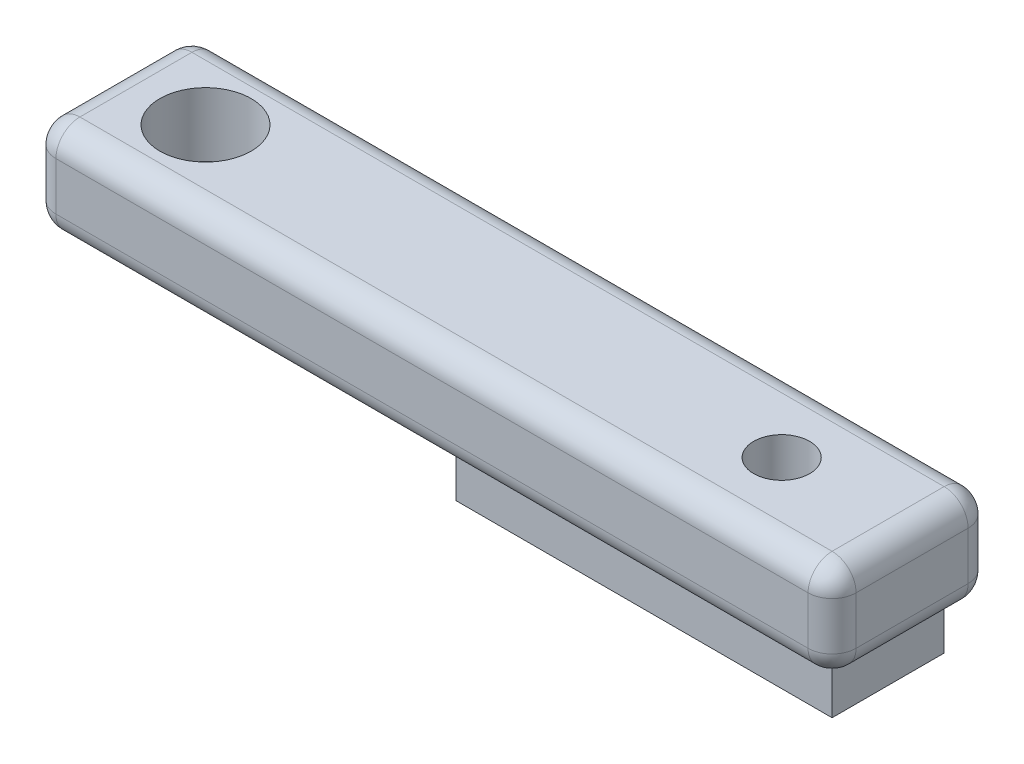
ISO-10303-21;
HEADER;
FILE_DESCRIPTION(('STEP AP214'),'2;1');
FILE_NAME('part.step','',(''),(''),'','','');
FILE_SCHEMA(('AUTOMOTIVE_DESIGN { 1 0 10303 214 1 1 1 1 }'));
ENDSEC;
DATA;
#1=APPLICATION_CONTEXT('core data for automotive mechanical design processes');
#2=APPLICATION_PROTOCOL_DEFINITION('international standard','automotive_design',2000,#1);
#3=PRODUCT_CONTEXT('',#1,'mechanical');
#4=PRODUCT('Part','Part','',(#3));
#5=PRODUCT_RELATED_PRODUCT_CATEGORY('part','',(#4));
#6=PRODUCT_DEFINITION_FORMATION('','',#4);
#7=PRODUCT_DEFINITION_CONTEXT('part definition',#1,'design');
#8=PRODUCT_DEFINITION('design','',#6,#7);
#9=PRODUCT_DEFINITION_SHAPE('','',#8);
#10=(LENGTH_UNIT() NAMED_UNIT(*) SI_UNIT(.MILLI.,.METRE.));
#11=(NAMED_UNIT(*) PLANE_ANGLE_UNIT() SI_UNIT($,.RADIAN.));
#12=(NAMED_UNIT(*) SI_UNIT($,.STERADIAN.) SOLID_ANGLE_UNIT());
#13=UNCERTAINTY_MEASURE_WITH_UNIT(LENGTH_MEASURE(1.E-05),#10,'distance_accuracy_value','');
#14=(GEOMETRIC_REPRESENTATION_CONTEXT(3) GLOBAL_UNCERTAINTY_ASSIGNED_CONTEXT((#13)) GLOBAL_UNIT_ASSIGNED_CONTEXT((#10,
#11,#12)) REPRESENTATION_CONTEXT('',''));
#15=CARTESIAN_POINT('',(0.,0.,0.));
#16=DIRECTION('',(0.,0.,1.));
#17=DIRECTION('',(1.,0.,0.));
#18=AXIS2_PLACEMENT_3D('',#15,#16,#17);
#19=CARTESIAN_POINT('',(0.,0.,0.));
#20=DIRECTION('',(0.,1.,0.));
#21=DIRECTION('',(0.,0.,1.));
#22=AXIS2_PLACEMENT_3D('',#19,#20,#21);
#23=PLANE('',#22);
#24=CARTESIAN_POINT('',(-19.15,0.,0.));
#25=DIRECTION('',(0.,1.,0.));
#26=DIRECTION('',(0.,0.,1.));
#27=AXIS2_PLACEMENT_3D('',#24,#25,#26);
#28=CIRCLE('',#27,1.5);
#29=CARTESIAN_POINT('',(-19.15,0.,1.5));
#30=VERTEX_POINT('',#29);
#31=EDGE_CURVE('E43',#30,#30,#28,.T.);
#32=ORIENTED_EDGE('',*,*,#31,.T.);
#33=EDGE_LOOP('',(#32));
#34=FACE_BOUND('',#33,.T.);
#35=DIRECTION('',(0.,0.,-1.));
#36=VECTOR('',#35,1.);
#37=CARTESIAN_POINT('',(0.,0.,3.5));
#38=LINE('',#37,#36);
#39=CARTESIAN_POINT('',(0.,0.,3.5));
#40=VERTEX_POINT('',#39);
#41=CARTESIAN_POINT('',(0.,0.,-3.5));
#42=VERTEX_POINT('',#41);
#43=EDGE_CURVE('E56',#40,#42,#38,.T.);
#44=ORIENTED_EDGE('',*,*,#43,.F.);
#45=DIRECTION('',(1.,0.,0.));
#46=VECTOR('',#45,1.);
#47=CARTESIAN_POINT('',(0.,0.,3.5));
#48=LINE('',#47,#46);
#49=CARTESIAN_POINT('',(-23.5,0.,3.5));
#50=VERTEX_POINT('',#49);
#51=EDGE_CURVE('E211',#40,#50,#48,.F.);
#52=ORIENTED_EDGE('',*,*,#51,.T.);
#53=DIRECTION('',(0.,0.,1.));
#54=VECTOR('',#53,1.);
#55=CARTESIAN_POINT('',(-23.5,0.,0.));
#56=LINE('',#55,#54);
#57=CARTESIAN_POINT('',(-23.5,0.,-3.5));
#58=VERTEX_POINT('',#57);
#59=EDGE_CURVE('E209',#50,#58,#56,.F.);
#60=ORIENTED_EDGE('',*,*,#59,.T.);
#61=DIRECTION('',(-1.,0.,0.));
#62=VECTOR('',#61,1.);
#63=CARTESIAN_POINT('',(0.,0.,-3.5));
#64=LINE('',#63,#62);
#65=EDGE_CURVE('E207',#58,#42,#64,.F.);
#66=ORIENTED_EDGE('',*,*,#65,.T.);
#67=EDGE_LOOP('',(#44,#52,#60,#66));
#68=FACE_BOUND('',#67,.T.);
#69=ADVANCED_FACE('F39',(#34,#68),#23,.F.);
#70=CARTESIAN_POINT('',(25.,6.,-5.));
#71=DIRECTION('',(-1.,0.,0.));
#72=DIRECTION('',(0.,0.,1.));
#73=AXIS2_PLACEMENT_3D('',#70,#71,#72);
#74=PLANE('',#73);
#75=DIRECTION('',(0.,0.,-1.));
#76=VECTOR('',#75,1.);
#77=CARTESIAN_POINT('',(25.,4.5,5.));
#78=LINE('',#77,#76);
#79=CARTESIAN_POINT('',(25.,4.5,-3.5));
#80=VERTEX_POINT('',#79);
#81=CARTESIAN_POINT('',(25.,4.5,3.5));
#82=VERTEX_POINT('',#81);
#83=EDGE_CURVE('E202',#80,#82,#78,.F.);
#84=ORIENTED_EDGE('',*,*,#83,.T.);
#85=DIRECTION('',(0.,-1.,0.));
#86=VECTOR('',#85,1.);
#87=CARTESIAN_POINT('',(25.,6.,3.5));
#88=LINE('',#87,#86);
#89=CARTESIAN_POINT('',(25.,1.5,3.5));
#90=VERTEX_POINT('',#89);
#91=EDGE_CURVE('E205',#82,#90,#88,.T.);
#92=ORIENTED_EDGE('',*,*,#91,.T.);
#93=DIRECTION('',(0.,0.,-1.));
#94=VECTOR('',#93,1.);
#95=CARTESIAN_POINT('',(25.,1.5,-5.));
#96=LINE('',#95,#94);
#97=CARTESIAN_POINT('',(25.,1.5,-3.5));
#98=VERTEX_POINT('',#97);
#99=EDGE_CURVE('E200',#90,#98,#96,.T.);
#100=ORIENTED_EDGE('',*,*,#99,.T.);
#101=DIRECTION('',(0.,-1.,0.));
#102=VECTOR('',#101,1.);
#103=CARTESIAN_POINT('',(25.,6.,-3.5));
#104=LINE('',#103,#102);
#105=EDGE_CURVE('E198',#98,#80,#104,.F.);
#106=ORIENTED_EDGE('',*,*,#105,.T.);
#107=EDGE_LOOP('',(#84,#92,#100,#106));
#108=FACE_BOUND('',#107,.T.);
#109=ADVANCED_FACE('F382',(#108),#74,.F.);
#110=CARTESIAN_POINT('',(-25.,6.,-5.));
#111=DIRECTION('',(0.,0.,1.));
#112=DIRECTION('',(1.,0.,0.));
#113=AXIS2_PLACEMENT_3D('',#110,#111,#112);
#114=PLANE('',#113);
#115=DIRECTION('',(-1.,0.,0.));
#116=VECTOR('',#115,1.);
#117=CARTESIAN_POINT('',(25.,4.5,-5.));
#118=LINE('',#117,#116);
#119=CARTESIAN_POINT('',(-23.5,4.5,-5.));
#120=VERTEX_POINT('',#119);
#121=CARTESIAN_POINT('',(23.5,4.5,-5.));
#122=VERTEX_POINT('',#121);
#123=EDGE_CURVE('E48',#120,#122,#118,.F.);
#124=ORIENTED_EDGE('',*,*,#123,.T.);
#125=DIRECTION('',(0.,-1.,0.));
#126=VECTOR('',#125,1.);
#127=CARTESIAN_POINT('',(23.5,6.,-5.));
#128=LINE('',#127,#126);
#129=CARTESIAN_POINT('',(23.5,1.5,-5.));
#130=VERTEX_POINT('',#129);
#131=EDGE_CURVE('E11',#122,#130,#128,.T.);
#132=ORIENTED_EDGE('',*,*,#131,.T.);
#133=DIRECTION('',(-1.,0.,0.));
#134=VECTOR('',#133,1.);
#135=CARTESIAN_POINT('',(-25.,1.5,-5.));
#136=LINE('',#135,#134);
#137=CARTESIAN_POINT('',(-23.5,1.5,-5.));
#138=VERTEX_POINT('',#137);
#139=EDGE_CURVE('E233',#130,#138,#136,.T.);
#140=ORIENTED_EDGE('',*,*,#139,.T.);
#141=DIRECTION('',(0.,-1.,0.));
#142=VECTOR('',#141,1.);
#143=CARTESIAN_POINT('',(-23.5,6.,-5.));
#144=LINE('',#143,#142);
#145=EDGE_CURVE('E235',#138,#120,#144,.F.);
#146=ORIENTED_EDGE('',*,*,#145,.T.);
#147=EDGE_LOOP('',(#124,#132,#140,#146));
#148=FACE_BOUND('',#147,.T.);
#149=ADVANCED_FACE('F387',(#148),#114,.F.);
#150=CARTESIAN_POINT('',(-25.,6.,-5.));
#151=DIRECTION('',(1.,0.,0.));
#152=DIRECTION('',(0.,0.,-1.));
#153=AXIS2_PLACEMENT_3D('',#150,#151,#152);
#154=PLANE('',#153);
#155=DIRECTION('',(0.,-1.,0.));
#156=VECTOR('',#155,1.);
#157=CARTESIAN_POINT('',(-25.,6.,3.5));
#158=LINE('',#157,#156);
#159=CARTESIAN_POINT('',(-25.,1.5,3.5));
#160=VERTEX_POINT('',#159);
#161=CARTESIAN_POINT('',(-25.,4.5,3.5));
#162=VERTEX_POINT('',#161);
#163=EDGE_CURVE('E228',#160,#162,#158,.F.);
#164=ORIENTED_EDGE('',*,*,#163,.T.);
#165=DIRECTION('',(0.,0.,1.));
#166=VECTOR('',#165,1.);
#167=CARTESIAN_POINT('',(-25.,4.5,-5.));
#168=LINE('',#167,#166);
#169=CARTESIAN_POINT('',(-25.,4.5,-3.5));
#170=VERTEX_POINT('',#169);
#171=EDGE_CURVE('E230',#162,#170,#168,.F.);
#172=ORIENTED_EDGE('',*,*,#171,.T.);
#173=DIRECTION('',(0.,-1.,0.));
#174=VECTOR('',#173,1.);
#175=CARTESIAN_POINT('',(-25.,6.,-3.5));
#176=LINE('',#175,#174);
#177=CARTESIAN_POINT('',(-25.,1.5,-3.5));
#178=VERTEX_POINT('',#177);
#179=EDGE_CURVE('E224',#170,#178,#176,.T.);
#180=ORIENTED_EDGE('',*,*,#179,.T.);
#181=DIRECTION('',(0.,0.,1.));
#182=VECTOR('',#181,1.);
#183=CARTESIAN_POINT('',(-25.,1.5,-5.));
#184=LINE('',#183,#182);
#185=EDGE_CURVE('E226',#178,#160,#184,.T.);
#186=ORIENTED_EDGE('',*,*,#185,.T.);
#187=EDGE_LOOP('',(#164,#172,#180,#186));
#188=FACE_BOUND('',#187,.T.);
#189=ADVANCED_FACE('F323',(#188),#154,.F.);
#190=CARTESIAN_POINT('',(-25.,6.,5.));
#191=DIRECTION('',(0.,0.,-1.));
#192=DIRECTION('',(-1.,0.,0.));
#193=AXIS2_PLACEMENT_3D('',#190,#191,#192);
#194=PLANE('',#193);
#195=DIRECTION('',(0.,-1.,0.));
#196=VECTOR('',#195,1.);
#197=CARTESIAN_POINT('',(23.5,6.,5.));
#198=LINE('',#197,#196);
#199=CARTESIAN_POINT('',(23.5,1.5,5.));
#200=VERTEX_POINT('',#199);
#201=CARTESIAN_POINT('',(23.5,4.5,5.));
#202=VERTEX_POINT('',#201);
#203=EDGE_CURVE('E219',#200,#202,#198,.F.);
#204=ORIENTED_EDGE('',*,*,#203,.T.);
#205=DIRECTION('',(1.,0.,0.));
#206=VECTOR('',#205,1.);
#207=CARTESIAN_POINT('',(-25.,4.5,5.));
#208=LINE('',#207,#206);
#209=CARTESIAN_POINT('',(-23.5,4.5,5.));
#210=VERTEX_POINT('',#209);
#211=EDGE_CURVE('E221',#202,#210,#208,.F.);
#212=ORIENTED_EDGE('',*,*,#211,.T.);
#213=DIRECTION('',(0.,-1.,0.));
#214=VECTOR('',#213,1.);
#215=CARTESIAN_POINT('',(-23.5,6.,5.));
#216=LINE('',#215,#214);
#217=CARTESIAN_POINT('',(-23.5,1.5,5.));
#218=VERTEX_POINT('',#217);
#219=EDGE_CURVE('E215',#210,#218,#216,.T.);
#220=ORIENTED_EDGE('',*,*,#219,.T.);
#221=DIRECTION('',(1.,0.,0.));
#222=VECTOR('',#221,1.);
#223=CARTESIAN_POINT('',(-25.,1.5,5.));
#224=LINE('',#223,#222);
#225=EDGE_CURVE('E217',#218,#200,#224,.T.);
#226=ORIENTED_EDGE('',*,*,#225,.T.);
#227=EDGE_LOOP('',(#204,#212,#220,#226));
#228=FACE_BOUND('',#227,.T.);
#229=ADVANCED_FACE('F314',(#228),#194,.F.);
#230=CARTESIAN_POINT('',(0.,6.,0.));
#231=DIRECTION('',(0.,1.,0.));
#232=DIRECTION('',(0.,0.,1.));
#233=AXIS2_PLACEMENT_3D('',#230,#231,#232);
#234=PLANE('',#233);
#235=CARTESIAN_POINT('',(16.85,6.,0.));
#236=DIRECTION('',(0.,1.,0.));
#237=DIRECTION('',(0.,0.,1.));
#238=AXIS2_PLACEMENT_3D('',#235,#236,#237);
#239=CIRCLE('',#238,1.75);
#240=CARTESIAN_POINT('',(16.85,6.,1.75));
#241=VERTEX_POINT('',#240);
#242=EDGE_CURVE('E360',#241,#241,#239,.T.);
#243=ORIENTED_EDGE('',*,*,#242,.F.);
#244=EDGE_LOOP('',(#243));
#245=FACE_BOUND('',#244,.T.);
#246=DIRECTION('',(1.,0.,0.));
#247=VECTOR('',#246,1.);
#248=CARTESIAN_POINT('',(25.,6.,3.5));
#249=LINE('',#248,#247);
#250=CARTESIAN_POINT('',(-23.5,6.,3.5));
#251=VERTEX_POINT('',#250);
#252=CARTESIAN_POINT('',(23.5,6.,3.5));
#253=VERTEX_POINT('',#252);
#254=EDGE_CURVE('E193',#251,#253,#249,.T.);
#255=ORIENTED_EDGE('',*,*,#254,.T.);
#256=DIRECTION('',(0.,0.,-1.));
#257=VECTOR('',#256,1.);
#258=CARTESIAN_POINT('',(23.5,6.,-5.));
#259=LINE('',#258,#257);
#260=CARTESIAN_POINT('',(23.5,6.,-3.5));
#261=VERTEX_POINT('',#260);
#262=EDGE_CURVE('E195',#253,#261,#259,.T.);
#263=ORIENTED_EDGE('',*,*,#262,.T.);
#264=DIRECTION('',(-1.,0.,0.));
#265=VECTOR('',#264,1.);
#266=CARTESIAN_POINT('',(-25.,6.,-3.5));
#267=LINE('',#266,#265);
#268=CARTESIAN_POINT('',(-23.5,6.,-3.5));
#269=VERTEX_POINT('',#268);
#270=EDGE_CURVE('E185',#261,#269,#267,.T.);
#271=ORIENTED_EDGE('',*,*,#270,.T.);
#272=DIRECTION('',(0.,0.,1.));
#273=VECTOR('',#272,1.);
#274=CARTESIAN_POINT('',(-23.5,6.,5.));
#275=LINE('',#274,#273);
#276=EDGE_CURVE('E191',#269,#251,#275,.T.);
#277=ORIENTED_EDGE('',*,*,#276,.T.);
#278=EDGE_LOOP('',(#255,#263,#271,#277));
#279=FACE_BOUND('',#278,.T.);
#280=CARTESIAN_POINT('',(-19.15,6.,0.));
#281=DIRECTION('',(0.,1.,0.));
#282=DIRECTION('',(0.,0.,1.));
#283=AXIS2_PLACEMENT_3D('',#280,#281,#282);
#284=CIRCLE('',#283,2.85);
#285=CARTESIAN_POINT('',(-19.15,6.,2.85));
#286=VERTEX_POINT('',#285);
#287=EDGE_CURVE('E186',#286,#286,#284,.T.);
#288=ORIENTED_EDGE('',*,*,#287,.F.);
#289=EDGE_LOOP('',(#288));
#290=FACE_BOUND('',#289,.T.);
#291=ADVANCED_FACE('F392',(#245,#279,#290),#234,.T.);
#292=CARTESIAN_POINT('',(-19.15,2.,0.));
#293=DIRECTION('',(0.,1.,0.));
#294=DIRECTION('',(0.,0.,1.));
#295=AXIS2_PLACEMENT_3D('',#292,#293,#294);
#296=CYLINDRICAL_SURFACE('',#295,2.85);
#297=CARTESIAN_POINT('',(-19.15,2.,0.));
#298=DIRECTION('',(0.,1.,0.));
#299=DIRECTION('',(0.,0.,1.));
#300=AXIS2_PLACEMENT_3D('',#297,#298,#299);
#301=CIRCLE('',#300,2.85);
#302=CARTESIAN_POINT('',(-19.15,2.,2.85));
#303=VERTEX_POINT('',#302);
#304=EDGE_CURVE('E182',#303,#303,#301,.T.);
#305=ORIENTED_EDGE('',*,*,#304,.F.);
#306=EDGE_LOOP('',(#305));
#307=FACE_BOUND('',#306,.T.);
#308=ORIENTED_EDGE('',*,*,#287,.T.);
#309=EDGE_LOOP('',(#308));
#310=FACE_BOUND('',#309,.T.);
#311=ADVANCED_FACE('F466',(#307,#310),#296,.F.);
#312=CARTESIAN_POINT('',(-19.15,2.,0.));
#313=DIRECTION('',(0.,1.,0.));
#314=DIRECTION('',(0.,0.,1.));
#315=AXIS2_PLACEMENT_3D('',#312,#313,#314);
#316=PLANE('',#315);
#317=CARTESIAN_POINT('',(-19.15,2.,0.));
#318=DIRECTION('',(0.,1.,0.));
#319=DIRECTION('',(0.,0.,1.));
#320=AXIS2_PLACEMENT_3D('',#317,#318,#319);
#321=CIRCLE('',#320,1.5);
#322=CARTESIAN_POINT('',(-19.15,2.,1.5));
#323=VERTEX_POINT('',#322);
#324=EDGE_CURVE('E363',#323,#323,#321,.T.);
#325=ORIENTED_EDGE('',*,*,#324,.F.);
#326=EDGE_LOOP('',(#325));
#327=FACE_BOUND('',#326,.T.);
#328=ORIENTED_EDGE('',*,*,#304,.T.);
#329=EDGE_LOOP('',(#328));
#330=FACE_BOUND('',#329,.T.);
#331=ADVANCED_FACE('F463',(#327,#330),#316,.T.);
#332=CARTESIAN_POINT('',(-23.5,1.5,-5.));
#333=DIRECTION('',(0.,0.,1.));
#334=DIRECTION('',(1.,0.,0.));
#335=AXIS2_PLACEMENT_3D('',#332,#333,#334);
#336=CYLINDRICAL_SURFACE('',#335,1.5);
#337=CARTESIAN_POINT('',(-23.5,1.5,3.5));
#338=DIRECTION('',(0.,0.,1.));
#339=DIRECTION('',(1.,0.,0.));
#340=AXIS2_PLACEMENT_3D('',#337,#338,#339);
#341=CIRCLE('',#340,1.5);
#342=EDGE_CURVE('E189',#160,#50,#341,.T.);
#343=ORIENTED_EDGE('',*,*,#342,.F.);
#344=ORIENTED_EDGE('',*,*,#185,.F.);
#345=CARTESIAN_POINT('',(-23.5,1.5,-3.5));
#346=DIRECTION('',(0.,0.,-1.));
#347=DIRECTION('',(-1.,0.,0.));
#348=AXIS2_PLACEMENT_3D('',#345,#346,#347);
#349=CIRCLE('',#348,1.5);
#350=EDGE_CURVE('E296',#58,#178,#349,.T.);
#351=ORIENTED_EDGE('',*,*,#350,.F.);
#352=ORIENTED_EDGE('',*,*,#59,.F.);
#353=EDGE_LOOP('',(#343,#344,#351,#352));
#354=FACE_BOUND('',#353,.T.);
#355=ADVANCED_FACE('F41',(#354),#336,.T.);
#356=CARTESIAN_POINT('',(-23.5,1.5,3.5));
#357=DIRECTION('',(0.,-1.,0.));
#358=DIRECTION('',(0.,0.,-1.));
#359=AXIS2_PLACEMENT_3D('',#356,#357,#358);
#360=SPHERICAL_SURFACE('',#359,1.5);
#361=CARTESIAN_POINT('',(-23.5,1.5,3.5));
#362=DIRECTION('',(0.,-1.,0.));
#363=DIRECTION('',(0.,0.,-1.));
#364=AXIS2_PLACEMENT_3D('',#361,#362,#363);
#365=CIRCLE('',#364,1.5);
#366=EDGE_CURVE('E290',#160,#218,#365,.F.);
#367=ORIENTED_EDGE('',*,*,#366,.F.);
#368=ORIENTED_EDGE('',*,*,#342,.T.);
#369=CARTESIAN_POINT('',(-23.5,1.5,3.5));
#370=DIRECTION('',(-1.,0.,0.));
#371=DIRECTION('',(0.,0.,1.));
#372=AXIS2_PLACEMENT_3D('',#369,#370,#371);
#373=CIRCLE('',#372,1.5);
#374=EDGE_CURVE('E293',#218,#50,#373,.F.);
#375=ORIENTED_EDGE('',*,*,#374,.F.);
#376=EDGE_LOOP('',(#367,#368,#375));
#377=FACE_BOUND('',#376,.T.);
#378=ADVANCED_FACE('F303',(#377),#360,.T.);
#379=CARTESIAN_POINT('',(-23.5,1.5,-3.5));
#380=DIRECTION('',(-1.,0.,0.));
#381=DIRECTION('',(0.,-1.,0.));
#382=AXIS2_PLACEMENT_3D('',#379,#380,#381);
#383=SPHERICAL_SURFACE('',#382,1.5);
#384=CARTESIAN_POINT('',(-23.5,1.5,-3.5));
#385=DIRECTION('',(-1.,0.,0.));
#386=DIRECTION('',(0.,0.,1.));
#387=AXIS2_PLACEMENT_3D('',#384,#385,#386);
#388=CIRCLE('',#387,1.5);
#389=EDGE_CURVE('E284',#58,#138,#388,.F.);
#390=ORIENTED_EDGE('',*,*,#389,.F.);
#391=ORIENTED_EDGE('',*,*,#350,.T.);
#392=CARTESIAN_POINT('',(-23.5,1.5,-3.5));
#393=DIRECTION('',(0.,-1.,0.));
#394=DIRECTION('',(0.,0.,-1.));
#395=AXIS2_PLACEMENT_3D('',#392,#393,#394);
#396=CIRCLE('',#395,1.5);
#397=EDGE_CURVE('E287',#138,#178,#396,.F.);
#398=ORIENTED_EDGE('',*,*,#397,.F.);
#399=EDGE_LOOP('',(#390,#391,#398));
#400=FACE_BOUND('',#399,.T.);
#401=ADVANCED_FACE('F341',(#400),#383,.T.);
#402=CARTESIAN_POINT('',(-25.,1.5,3.5));
#403=DIRECTION('',(1.,0.,0.));
#404=DIRECTION('',(0.,0.,-1.));
#405=AXIS2_PLACEMENT_3D('',#402,#403,#404);
#406=CYLINDRICAL_SURFACE('',#405,1.5);
#407=ORIENTED_EDGE('',*,*,#374,.T.);
#408=ORIENTED_EDGE('',*,*,#51,.F.);
#409=CARTESIAN_POINT('',(23.5,0.,3.5));
#410=VERTEX_POINT('',#409);
#411=EDGE_CURVE('E212',#410,#40,#48,.F.);
#412=ORIENTED_EDGE('',*,*,#411,.F.);
#413=CARTESIAN_POINT('',(23.5,1.5,3.5));
#414=DIRECTION('',(1.,0.,0.));
#415=DIRECTION('',(0.,0.,-1.));
#416=AXIS2_PLACEMENT_3D('',#413,#414,#415);
#417=CIRCLE('',#416,1.5);
#418=EDGE_CURVE('E278',#200,#410,#417,.T.);
#419=ORIENTED_EDGE('',*,*,#418,.F.);
#420=ORIENTED_EDGE('',*,*,#225,.F.);
#421=EDGE_LOOP('',(#407,#408,#412,#419,#420));
#422=FACE_BOUND('',#421,.T.);
#423=ADVANCED_FACE('F310',(#422),#406,.T.);
#424=CARTESIAN_POINT('',(-23.5,6.,3.5));
#425=DIRECTION('',(0.,-1.,0.));
#426=DIRECTION('',(0.,0.,-1.));
#427=AXIS2_PLACEMENT_3D('',#424,#425,#426);
#428=CYLINDRICAL_SURFACE('',#427,1.5);
#429=ORIENTED_EDGE('',*,*,#366,.T.);
#430=ORIENTED_EDGE('',*,*,#219,.F.);
#431=CARTESIAN_POINT('',(-23.5,4.5,3.5));
#432=DIRECTION('',(0.,1.,0.));
#433=DIRECTION('',(0.,0.,1.));
#434=AXIS2_PLACEMENT_3D('',#431,#432,#433);
#435=CIRCLE('',#434,1.5);
#436=EDGE_CURVE('E275',#162,#210,#435,.T.);
#437=ORIENTED_EDGE('',*,*,#436,.F.);
#438=ORIENTED_EDGE('',*,*,#163,.F.);
#439=EDGE_LOOP('',(#429,#430,#437,#438));
#440=FACE_BOUND('',#439,.T.);
#441=ADVANCED_FACE('F320',(#440),#428,.T.);
#442=CARTESIAN_POINT('',(-23.5,4.5,0.));
#443=DIRECTION('',(0.,0.,-1.));
#444=DIRECTION('',(-1.,0.,0.));
#445=AXIS2_PLACEMENT_3D('',#442,#443,#444);
#446=CYLINDRICAL_SURFACE('',#445,1.5);
#447=CARTESIAN_POINT('',(-23.5,4.5,-3.5));
#448=DIRECTION('',(0.,0.,-1.));
#449=DIRECTION('',(-1.,0.,0.));
#450=AXIS2_PLACEMENT_3D('',#447,#448,#449);
#451=CIRCLE('',#450,1.5);
#452=EDGE_CURVE('E269',#170,#269,#451,.T.);
#453=ORIENTED_EDGE('',*,*,#452,.F.);
#454=ORIENTED_EDGE('',*,*,#171,.F.);
#455=CARTESIAN_POINT('',(-23.5,4.5,3.5));
#456=DIRECTION('',(0.,0.,1.));
#457=DIRECTION('',(1.,0.,0.));
#458=AXIS2_PLACEMENT_3D('',#455,#456,#457);
#459=CIRCLE('',#458,1.5);
#460=EDGE_CURVE('E272',#251,#162,#459,.T.);
#461=ORIENTED_EDGE('',*,*,#460,.F.);
#462=ORIENTED_EDGE('',*,*,#276,.F.);
#463=EDGE_LOOP('',(#453,#454,#461,#462));
#464=FACE_BOUND('',#463,.T.);
#465=ADVANCED_FACE('F327',(#464),#446,.T.);
#466=CARTESIAN_POINT('',(-23.5,6.,-3.5));
#467=DIRECTION('',(0.,-1.,0.));
#468=DIRECTION('',(0.,0.,-1.));
#469=AXIS2_PLACEMENT_3D('',#466,#467,#468);
#470=CYLINDRICAL_SURFACE('',#469,1.5);
#471=ORIENTED_EDGE('',*,*,#397,.T.);
#472=ORIENTED_EDGE('',*,*,#179,.F.);
#473=CARTESIAN_POINT('',(-23.5,4.5,-3.5));
#474=DIRECTION('',(0.,1.,0.));
#475=DIRECTION('',(0.,0.,1.));
#476=AXIS2_PLACEMENT_3D('',#473,#474,#475);
#477=CIRCLE('',#476,1.5);
#478=EDGE_CURVE('E267',#120,#170,#477,.T.);
#479=ORIENTED_EDGE('',*,*,#478,.F.);
#480=ORIENTED_EDGE('',*,*,#145,.F.);
#481=EDGE_LOOP('',(#471,#472,#479,#480));
#482=FACE_BOUND('',#481,.T.);
#483=ADVANCED_FACE('F335',(#482),#470,.T.);
#484=CARTESIAN_POINT('',(-25.,1.5,-3.5));
#485=DIRECTION('',(-1.,0.,0.));
#486=DIRECTION('',(0.,0.,1.));
#487=AXIS2_PLACEMENT_3D('',#484,#485,#486);
#488=CYLINDRICAL_SURFACE('',#487,1.5);
#489=ORIENTED_EDGE('',*,*,#389,.T.);
#490=ORIENTED_EDGE('',*,*,#139,.F.);
#491=CARTESIAN_POINT('',(23.5,1.5,-3.5));
#492=DIRECTION('',(1.,0.,0.));
#493=DIRECTION('',(0.,0.,-1.));
#494=AXIS2_PLACEMENT_3D('',#491,#492,#493);
#495=CIRCLE('',#494,1.5);
#496=CARTESIAN_POINT('',(23.5,0.,-3.5));
#497=VERTEX_POINT('',#496);
#498=EDGE_CURVE('E264',#497,#130,#495,.T.);
#499=ORIENTED_EDGE('',*,*,#498,.F.);
#500=DIRECTION('',(1.,0.,0.));
#501=VECTOR('',#500,1.);
#502=CARTESIAN_POINT('',(23.5,0.,-3.5));
#503=LINE('',#502,#501);
#504=EDGE_CURVE('E64',#42,#497,#503,.T.);
#505=ORIENTED_EDGE('',*,*,#504,.F.);
#506=ORIENTED_EDGE('',*,*,#65,.F.);
#507=EDGE_LOOP('',(#489,#490,#499,#505,#506));
#508=FACE_BOUND('',#507,.T.);
#509=ADVANCED_FACE('F343',(#508),#488,.T.);
#510=CARTESIAN_POINT('',(23.5,1.5,-5.));
#511=DIRECTION('',(0.,0.,-1.));
#512=DIRECTION('',(-1.,0.,0.));
#513=AXIS2_PLACEMENT_3D('',#510,#511,#512);
#514=CYLINDRICAL_SURFACE('',#513,1.5);
#515=CARTESIAN_POINT('',(23.5,1.5,3.5));
#516=DIRECTION('',(0.,0.,1.));
#517=DIRECTION('',(1.,0.,0.));
#518=AXIS2_PLACEMENT_3D('',#515,#516,#517);
#519=CIRCLE('',#518,1.5);
#520=EDGE_CURVE('E281',#410,#90,#519,.T.);
#521=ORIENTED_EDGE('',*,*,#520,.F.);
#522=DIRECTION('',(0.,0.,-1.));
#523=VECTOR('',#522,1.);
#524=CARTESIAN_POINT('',(23.5,0.,0.));
#525=LINE('',#524,#523);
#526=EDGE_CURVE('E173',#497,#410,#525,.F.);
#527=ORIENTED_EDGE('',*,*,#526,.F.);
#528=CARTESIAN_POINT('',(23.5,1.5,-3.5));
#529=DIRECTION('',(0.,0.,-1.));
#530=DIRECTION('',(-1.,0.,0.));
#531=AXIS2_PLACEMENT_3D('',#528,#529,#530);
#532=CIRCLE('',#531,1.5);
#533=EDGE_CURVE('E261',#98,#497,#532,.T.);
#534=ORIENTED_EDGE('',*,*,#533,.F.);
#535=ORIENTED_EDGE('',*,*,#99,.F.);
#536=EDGE_LOOP('',(#521,#527,#534,#535));
#537=FACE_BOUND('',#536,.T.);
#538=ADVANCED_FACE('F443',(#537),#514,.T.);
#539=CARTESIAN_POINT('',(23.5,1.5,3.5));
#540=DIRECTION('',(0.,-1.,0.));
#541=DIRECTION('',(0.,0.,-1.));
#542=AXIS2_PLACEMENT_3D('',#539,#540,#541);
#543=SPHERICAL_SURFACE('',#542,1.5);
#544=ORIENTED_EDGE('',*,*,#418,.T.);
#545=ORIENTED_EDGE('',*,*,#520,.T.);
#546=CARTESIAN_POINT('',(23.5,1.5,3.5));
#547=DIRECTION('',(0.,-1.,0.));
#548=DIRECTION('',(0.,0.,-1.));
#549=AXIS2_PLACEMENT_3D('',#546,#547,#548);
#550=CIRCLE('',#549,1.5);
#551=EDGE_CURVE('E258',#200,#90,#550,.F.);
#552=ORIENTED_EDGE('',*,*,#551,.F.);
#553=EDGE_LOOP('',(#544,#545,#552));
#554=FACE_BOUND('',#553,.T.);
#555=ADVANCED_FACE('F439',(#554),#543,.T.);
#556=CARTESIAN_POINT('',(-23.5,4.5,3.5));
#557=DIRECTION('',(-1.,0.,0.));
#558=DIRECTION('',(0.,0.,1.));
#559=AXIS2_PLACEMENT_3D('',#556,#557,#558);
#560=SPHERICAL_SURFACE('',#559,1.5);
#561=ORIENTED_EDGE('',*,*,#460,.T.);
#562=ORIENTED_EDGE('',*,*,#436,.T.);
#563=CARTESIAN_POINT('',(-23.5,4.5,3.5));
#564=DIRECTION('',(-1.,0.,0.));
#565=DIRECTION('',(0.,0.,1.));
#566=AXIS2_PLACEMENT_3D('',#563,#564,#565);
#567=CIRCLE('',#566,1.5);
#568=EDGE_CURVE('E256',#251,#210,#567,.F.);
#569=ORIENTED_EDGE('',*,*,#568,.F.);
#570=EDGE_LOOP('',(#561,#562,#569));
#571=FACE_BOUND('',#570,.T.);
#572=ADVANCED_FACE('F436',(#571),#560,.T.);
#573=CARTESIAN_POINT('',(-23.5,4.5,-3.5));
#574=DIRECTION('',(-1.,0.,0.));
#575=DIRECTION('',(0.,0.,1.));
#576=AXIS2_PLACEMENT_3D('',#573,#574,#575);
#577=SPHERICAL_SURFACE('',#576,1.5);
#578=ORIENTED_EDGE('',*,*,#478,.T.);
#579=ORIENTED_EDGE('',*,*,#452,.T.);
#580=CARTESIAN_POINT('',(-23.5,4.5,-3.5));
#581=DIRECTION('',(-1.,0.,0.));
#582=DIRECTION('',(0.,0.,1.));
#583=AXIS2_PLACEMENT_3D('',#580,#581,#582);
#584=CIRCLE('',#583,1.5);
#585=EDGE_CURVE('E253',#120,#269,#584,.F.);
#586=ORIENTED_EDGE('',*,*,#585,.F.);
#587=EDGE_LOOP('',(#578,#579,#586));
#588=FACE_BOUND('',#587,.T.);
#589=ADVANCED_FACE('F432',(#588),#577,.T.);
#590=CARTESIAN_POINT('',(23.5,1.5,-3.5));
#591=DIRECTION('',(0.,-1.,0.));
#592=DIRECTION('',(0.,0.,-1.));
#593=AXIS2_PLACEMENT_3D('',#590,#591,#592);
#594=SPHERICAL_SURFACE('',#593,1.5);
#595=ORIENTED_EDGE('',*,*,#533,.T.);
#596=ORIENTED_EDGE('',*,*,#498,.T.);
#597=CARTESIAN_POINT('',(23.5,1.5,-3.5));
#598=DIRECTION('',(0.,-1.,0.));
#599=DIRECTION('',(0.,0.,-1.));
#600=AXIS2_PLACEMENT_3D('',#597,#598,#599);
#601=CIRCLE('',#600,1.5);
#602=EDGE_CURVE('E251',#98,#130,#601,.F.);
#603=ORIENTED_EDGE('',*,*,#602,.F.);
#604=EDGE_LOOP('',(#595,#596,#603));
#605=FACE_BOUND('',#604,.T.);
#606=ADVANCED_FACE('F428',(#605),#594,.T.);
#607=CARTESIAN_POINT('',(23.5,6.,3.5));
#608=DIRECTION('',(0.,-1.,0.));
#609=DIRECTION('',(0.,0.,-1.));
#610=AXIS2_PLACEMENT_3D('',#607,#608,#609);
#611=CYLINDRICAL_SURFACE('',#610,1.5);
#612=ORIENTED_EDGE('',*,*,#551,.T.);
#613=ORIENTED_EDGE('',*,*,#91,.F.);
#614=CARTESIAN_POINT('',(23.5,4.5,3.5));
#615=DIRECTION('',(0.,1.,0.));
#616=DIRECTION('',(0.,0.,1.));
#617=AXIS2_PLACEMENT_3D('',#614,#615,#616);
#618=CIRCLE('',#617,1.5);
#619=EDGE_CURVE('E248',#202,#82,#618,.T.);
#620=ORIENTED_EDGE('',*,*,#619,.F.);
#621=ORIENTED_EDGE('',*,*,#203,.F.);
#622=EDGE_LOOP('',(#612,#613,#620,#621));
#623=FACE_BOUND('',#622,.T.);
#624=ADVANCED_FACE('F424',(#623),#611,.T.);
#625=CARTESIAN_POINT('',(0.,4.5,3.5));
#626=DIRECTION('',(-1.,0.,0.));
#627=DIRECTION('',(0.,0.,1.));
#628=AXIS2_PLACEMENT_3D('',#625,#626,#627);
#629=CYLINDRICAL_SURFACE('',#628,1.5);
#630=ORIENTED_EDGE('',*,*,#568,.T.);
#631=ORIENTED_EDGE('',*,*,#211,.F.);
#632=CARTESIAN_POINT('',(23.5,4.5,3.5));
#633=DIRECTION('',(1.,0.,0.));
#634=DIRECTION('',(0.,0.,-1.));
#635=AXIS2_PLACEMENT_3D('',#632,#633,#634);
#636=CIRCLE('',#635,1.5);
#637=EDGE_CURVE('E245',#253,#202,#636,.T.);
#638=ORIENTED_EDGE('',*,*,#637,.F.);
#639=ORIENTED_EDGE('',*,*,#254,.F.);
#640=EDGE_LOOP('',(#630,#631,#638,#639));
#641=FACE_BOUND('',#640,.T.);
#642=ADVANCED_FACE('F420',(#641),#629,.T.);
#643=CARTESIAN_POINT('',(0.,4.5,-3.5));
#644=DIRECTION('',(1.,0.,0.));
#645=DIRECTION('',(0.,0.,-1.));
#646=AXIS2_PLACEMENT_3D('',#643,#644,#645);
#647=CYLINDRICAL_SURFACE('',#646,1.5);
#648=ORIENTED_EDGE('',*,*,#585,.T.);
#649=ORIENTED_EDGE('',*,*,#270,.F.);
#650=CARTESIAN_POINT('',(23.5,4.5,-3.5));
#651=DIRECTION('',(1.,0.,0.));
#652=DIRECTION('',(0.,0.,-1.));
#653=AXIS2_PLACEMENT_3D('',#650,#651,#652);
#654=CIRCLE('',#653,1.5);
#655=EDGE_CURVE('E242',#122,#261,#654,.T.);
#656=ORIENTED_EDGE('',*,*,#655,.F.);
#657=ORIENTED_EDGE('',*,*,#123,.F.);
#658=EDGE_LOOP('',(#648,#649,#656,#657));
#659=FACE_BOUND('',#658,.T.);
#660=ADVANCED_FACE('F416',(#659),#647,.T.);
#661=CARTESIAN_POINT('',(23.5,6.,-3.5));
#662=DIRECTION('',(0.,-1.,0.));
#663=DIRECTION('',(0.,0.,-1.));
#664=AXIS2_PLACEMENT_3D('',#661,#662,#663);
#665=CYLINDRICAL_SURFACE('',#664,1.5);
#666=ORIENTED_EDGE('',*,*,#602,.T.);
#667=ORIENTED_EDGE('',*,*,#131,.F.);
#668=CARTESIAN_POINT('',(23.5,4.5,-3.5));
#669=DIRECTION('',(0.,1.,0.));
#670=DIRECTION('',(0.,0.,1.));
#671=AXIS2_PLACEMENT_3D('',#668,#669,#670);
#672=CIRCLE('',#671,1.5);
#673=EDGE_CURVE('E239',#80,#122,#672,.T.);
#674=ORIENTED_EDGE('',*,*,#673,.F.);
#675=ORIENTED_EDGE('',*,*,#105,.F.);
#676=EDGE_LOOP('',(#666,#667,#674,#675));
#677=FACE_BOUND('',#676,.T.);
#678=ADVANCED_FACE('F412',(#677),#665,.T.);
#679=CARTESIAN_POINT('',(23.5,4.5,3.5));
#680=DIRECTION('',(0.,0.,1.));
#681=DIRECTION('',(1.,0.,0.));
#682=AXIS2_PLACEMENT_3D('',#679,#680,#681);
#683=SPHERICAL_SURFACE('',#682,1.5);
#684=ORIENTED_EDGE('',*,*,#637,.T.);
#685=ORIENTED_EDGE('',*,*,#619,.T.);
#686=CARTESIAN_POINT('',(23.5,4.5,3.5));
#687=DIRECTION('',(0.,0.,1.));
#688=DIRECTION('',(0.,-1.,0.));
#689=AXIS2_PLACEMENT_3D('',#686,#687,#688);
#690=CIRCLE('',#689,1.5);
#691=EDGE_CURVE('E176',#253,#82,#690,.F.);
#692=ORIENTED_EDGE('',*,*,#691,.F.);
#693=EDGE_LOOP('',(#684,#685,#692));
#694=FACE_BOUND('',#693,.T.);
#695=ADVANCED_FACE('F408',(#694),#683,.T.);
#696=CARTESIAN_POINT('',(23.5,4.5,-3.5));
#697=DIRECTION('',(0.,0.,-1.));
#698=DIRECTION('',(-1.,0.,0.));
#699=AXIS2_PLACEMENT_3D('',#696,#697,#698);
#700=SPHERICAL_SURFACE('',#699,1.5);
#701=ORIENTED_EDGE('',*,*,#673,.T.);
#702=ORIENTED_EDGE('',*,*,#655,.T.);
#703=CARTESIAN_POINT('',(23.5,4.5,-3.5));
#704=DIRECTION('',(0.,0.,-1.));
#705=DIRECTION('',(-1.,0.,0.));
#706=AXIS2_PLACEMENT_3D('',#703,#704,#705);
#707=CIRCLE('',#706,1.5);
#708=EDGE_CURVE('E174',#80,#261,#707,.F.);
#709=ORIENTED_EDGE('',*,*,#708,.F.);
#710=EDGE_LOOP('',(#701,#702,#709));
#711=FACE_BOUND('',#710,.T.);
#712=ADVANCED_FACE('F404',(#711),#700,.T.);
#713=CARTESIAN_POINT('',(23.5,4.5,0.));
#714=DIRECTION('',(0.,0.,1.));
#715=DIRECTION('',(1.,0.,0.));
#716=AXIS2_PLACEMENT_3D('',#713,#714,#715);
#717=CYLINDRICAL_SURFACE('',#716,1.5);
#718=ORIENTED_EDGE('',*,*,#691,.T.);
#719=ORIENTED_EDGE('',*,*,#83,.F.);
#720=ORIENTED_EDGE('',*,*,#708,.T.);
#721=ORIENTED_EDGE('',*,*,#262,.F.);
#722=EDGE_LOOP('',(#718,#719,#720,#721));
#723=FACE_BOUND('',#722,.T.);
#724=ADVANCED_FACE('F401',(#723),#717,.T.);
#725=CARTESIAN_POINT('',(0.,-3.01,0.));
#726=DIRECTION('',(0.,1.,0.));
#727=DIRECTION('',(0.,0.,1.));
#728=AXIS2_PLACEMENT_3D('',#725,#726,#727);
#729=PLANE('',#728);
#730=CARTESIAN_POINT('',(16.85,-3.01,0.));
#731=DIRECTION('',(0.,1.,0.));
#732=DIRECTION('',(0.,0.,1.));
#733=AXIS2_PLACEMENT_3D('',#730,#731,#732);
#734=CIRCLE('',#733,1.75);
#735=CARTESIAN_POINT('',(16.85,-3.01,1.75));
#736=VERTEX_POINT('',#735);
#737=EDGE_CURVE('E348',#736,#736,#734,.T.);
#738=ORIENTED_EDGE('',*,*,#737,.T.);
#739=EDGE_LOOP('',(#738));
#740=FACE_BOUND('',#739,.T.);
#741=DIRECTION('',(0.,0.,1.));
#742=VECTOR('',#741,1.);
#743=CARTESIAN_POINT('',(23.5,-3.01,3.5));
#744=LINE('',#743,#742);
#745=CARTESIAN_POINT('',(23.5,-3.01,-3.5));
#746=VERTEX_POINT('',#745);
#747=CARTESIAN_POINT('',(23.5,-3.01,3.5));
#748=VERTEX_POINT('',#747);
#749=EDGE_CURVE('E162',#746,#748,#744,.T.);
#750=ORIENTED_EDGE('',*,*,#749,.T.);
#751=DIRECTION('',(-1.,0.,0.));
#752=VECTOR('',#751,1.);
#753=CARTESIAN_POINT('',(23.5,-3.01,3.5));
#754=LINE('',#753,#752);
#755=CARTESIAN_POINT('',(0.,-3.01,3.5));
#756=VERTEX_POINT('',#755);
#757=EDGE_CURVE('E150',#748,#756,#754,.T.);
#758=ORIENTED_EDGE('',*,*,#757,.T.);
#759=DIRECTION('',(0.,0.,-1.));
#760=VECTOR('',#759,1.);
#761=CARTESIAN_POINT('',(0.,-3.01,3.5));
#762=LINE('',#761,#760);
#763=CARTESIAN_POINT('',(0.,-3.01,-3.5));
#764=VERTEX_POINT('',#763);
#765=EDGE_CURVE('E161',#756,#764,#762,.T.);
#766=ORIENTED_EDGE('',*,*,#765,.T.);
#767=DIRECTION('',(1.,0.,0.));
#768=VECTOR('',#767,1.);
#769=CARTESIAN_POINT('',(23.5,-3.01,-3.5));
#770=LINE('',#769,#768);
#771=EDGE_CURVE('E167',#764,#746,#770,.T.);
#772=ORIENTED_EDGE('',*,*,#771,.T.);
#773=EDGE_LOOP('',(#750,#758,#766,#772));
#774=FACE_BOUND('',#773,.T.);
#775=ADVANCED_FACE('F165',(#740,#774),#729,.F.);
#776=CARTESIAN_POINT('',(23.5,-3.01,-3.5));
#777=DIRECTION('',(0.,0.,1.));
#778=DIRECTION('',(1.,0.,0.));
#779=AXIS2_PLACEMENT_3D('',#776,#777,#778);
#780=PLANE('',#779);
#781=ORIENTED_EDGE('',*,*,#504,.T.);
#782=DIRECTION('',(0.,1.,0.));
#783=VECTOR('',#782,1.);
#784=CARTESIAN_POINT('',(23.5,-3.01,-3.5));
#785=LINE('',#784,#783);
#786=EDGE_CURVE('E352',#746,#497,#785,.T.);
#787=ORIENTED_EDGE('',*,*,#786,.F.);
#788=ORIENTED_EDGE('',*,*,#771,.F.);
#789=DIRECTION('',(0.,1.,0.));
#790=VECTOR('',#789,1.);
#791=CARTESIAN_POINT('',(0.,-3.01,-3.5));
#792=LINE('',#791,#790);
#793=EDGE_CURVE('E178',#764,#42,#792,.T.);
#794=ORIENTED_EDGE('',*,*,#793,.T.);
#795=EDGE_LOOP('',(#781,#787,#788,#794));
#796=FACE_BOUND('',#795,.T.);
#797=ADVANCED_FACE('F351',(#796),#780,.F.);
#798=CARTESIAN_POINT('',(0.,-3.01,3.5));
#799=DIRECTION('',(1.,0.,0.));
#800=DIRECTION('',(0.,0.,-1.));
#801=AXIS2_PLACEMENT_3D('',#798,#799,#800);
#802=PLANE('',#801);
#803=ORIENTED_EDGE('',*,*,#43,.T.);
#804=ORIENTED_EDGE('',*,*,#793,.F.);
#805=ORIENTED_EDGE('',*,*,#765,.F.);
#806=DIRECTION('',(0.,1.,0.));
#807=VECTOR('',#806,1.);
#808=CARTESIAN_POINT('',(0.,-3.01,3.5));
#809=LINE('',#808,#807);
#810=EDGE_CURVE('E158',#756,#40,#809,.T.);
#811=ORIENTED_EDGE('',*,*,#810,.T.);
#812=EDGE_LOOP('',(#803,#804,#805,#811));
#813=FACE_BOUND('',#812,.T.);
#814=ADVANCED_FACE('F347',(#813),#802,.F.);
#815=CARTESIAN_POINT('',(23.5,-3.01,3.5));
#816=DIRECTION('',(0.,0.,-1.));
#817=DIRECTION('',(-1.,0.,0.));
#818=AXIS2_PLACEMENT_3D('',#815,#816,#817);
#819=PLANE('',#818);
#820=ORIENTED_EDGE('',*,*,#411,.T.);
#821=ORIENTED_EDGE('',*,*,#810,.F.);
#822=ORIENTED_EDGE('',*,*,#757,.F.);
#823=DIRECTION('',(0.,1.,0.));
#824=VECTOR('',#823,1.);
#825=CARTESIAN_POINT('',(23.5,-3.01,3.5));
#826=LINE('',#825,#824);
#827=EDGE_CURVE('E155',#748,#410,#826,.T.);
#828=ORIENTED_EDGE('',*,*,#827,.T.);
#829=EDGE_LOOP('',(#820,#821,#822,#828));
#830=FACE_BOUND('',#829,.T.);
#831=ADVANCED_FACE('F153',(#830),#819,.F.);
#832=CARTESIAN_POINT('',(23.5,-3.01,3.5));
#833=DIRECTION('',(-1.,0.,0.));
#834=DIRECTION('',(0.,0.,1.));
#835=AXIS2_PLACEMENT_3D('',#832,#833,#834);
#836=PLANE('',#835);
#837=ORIENTED_EDGE('',*,*,#526,.T.);
#838=ORIENTED_EDGE('',*,*,#827,.F.);
#839=ORIENTED_EDGE('',*,*,#749,.F.);
#840=ORIENTED_EDGE('',*,*,#786,.T.);
#841=EDGE_LOOP('',(#837,#838,#839,#840));
#842=FACE_BOUND('',#841,.T.);
#843=ADVANCED_FACE('F172',(#842),#836,.F.);
#844=CARTESIAN_POINT('',(16.85,-3.01,0.));
#845=DIRECTION('',(0.,1.,0.));
#846=DIRECTION('',(0.,0.,1.));
#847=AXIS2_PLACEMENT_3D('',#844,#845,#846);
#848=CYLINDRICAL_SURFACE('',#847,1.75);
#849=ORIENTED_EDGE('',*,*,#737,.F.);
#850=EDGE_LOOP('',(#849));
#851=FACE_BOUND('',#850,.T.);
#852=ORIENTED_EDGE('',*,*,#242,.T.);
#853=EDGE_LOOP('',(#852));
#854=FACE_BOUND('',#853,.T.);
#855=ADVANCED_FACE('F373',(#851,#854),#848,.F.);
#856=CARTESIAN_POINT('',(-19.15,-8.,0.));
#857=DIRECTION('',(0.,1.,0.));
#858=DIRECTION('',(0.,0.,1.));
#859=AXIS2_PLACEMENT_3D('',#856,#857,#858);
#860=CYLINDRICAL_SURFACE('',#859,1.5);
#861=ORIENTED_EDGE('',*,*,#324,.T.);
#862=EDGE_LOOP('',(#861));
#863=FACE_BOUND('',#862,.T.);
#864=ORIENTED_EDGE('',*,*,#31,.F.);
#865=EDGE_LOOP('',(#864));
#866=FACE_BOUND('',#865,.T.);
#867=ADVANCED_FACE('F371',(#863,#866),#860,.F.);
#868=CLOSED_SHELL('',(#69,#109,#149,#189,#229,#291,#311,#331,#355,#378,#401,#423,#441,#465,#483,
#509,#538,#555,#572,#589,#606,#624,#642,#660,#678,#695,#712,#724,#775,#797,#814,#831,#843,#855,#867));
#869=MANIFOLD_SOLID_BREP('B2',#868);
#870=ADVANCED_BREP_SHAPE_REPRESENTATION('',(#18,#869),#14);
#871=SHAPE_DEFINITION_REPRESENTATION(#9,#870);
ENDSEC;
END-ISO-10303-21;
